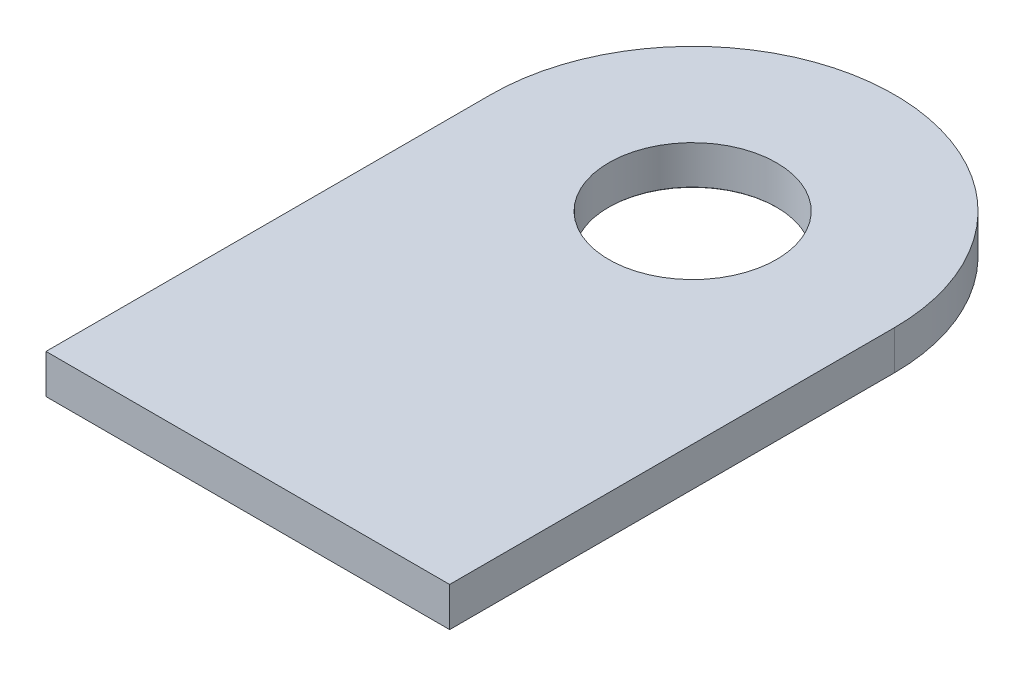
ISO-10303-21;
HEADER;
FILE_DESCRIPTION(('STEP AP214'),'2;1');
FILE_NAME('part.step','',(''),(''),'','','');
FILE_SCHEMA(('AUTOMOTIVE_DESIGN { 1 0 10303 214 1 1 1 1 }'));
ENDSEC;
DATA;
#1=APPLICATION_CONTEXT('core data for automotive mechanical design processes');
#2=APPLICATION_PROTOCOL_DEFINITION('international standard','automotive_design',2000,#1);
#3=PRODUCT_CONTEXT('',#1,'mechanical');
#4=PRODUCT('Part','Part','',(#3));
#5=PRODUCT_RELATED_PRODUCT_CATEGORY('part','',(#4));
#6=PRODUCT_DEFINITION_FORMATION('','',#4);
#7=PRODUCT_DEFINITION_CONTEXT('part definition',#1,'design');
#8=PRODUCT_DEFINITION('design','',#6,#7);
#9=PRODUCT_DEFINITION_SHAPE('','',#8);
#10=(LENGTH_UNIT() NAMED_UNIT(*) SI_UNIT(.MILLI.,.METRE.));
#11=(NAMED_UNIT(*) PLANE_ANGLE_UNIT() SI_UNIT($,.RADIAN.));
#12=(NAMED_UNIT(*) SI_UNIT($,.STERADIAN.) SOLID_ANGLE_UNIT());
#13=UNCERTAINTY_MEASURE_WITH_UNIT(LENGTH_MEASURE(1.E-05),#10,'distance_accuracy_value','');
#14=(GEOMETRIC_REPRESENTATION_CONTEXT(3) GLOBAL_UNCERTAINTY_ASSIGNED_CONTEXT((#13)) GLOBAL_UNIT_ASSIGNED_CONTEXT((#10,
#11,#12)) REPRESENTATION_CONTEXT('',''));
#15=CARTESIAN_POINT('',(0.,0.,0.));
#16=DIRECTION('',(0.,0.,1.));
#17=DIRECTION('',(1.,0.,0.));
#18=AXIS2_PLACEMENT_3D('',#15,#16,#17);
#19=CARTESIAN_POINT('',(0.,1.54,0.));
#20=DIRECTION('',(0.,-1.,0.));
#21=DIRECTION('',(0.,0.,-1.));
#22=AXIS2_PLACEMENT_3D('',#19,#20,#21);
#23=CYLINDRICAL_SURFACE('',#22,7.94);
#24=CARTESIAN_POINT('',(0.,0.,0.));
#25=DIRECTION('',(0.,1.,0.));
#26=DIRECTION('',(0.,0.,1.));
#27=AXIS2_PLACEMENT_3D('',#24,#25,#26);
#28=CIRCLE('',#27,7.94);
#29=CARTESIAN_POINT('',(7.94,0.,0.));
#30=VERTEX_POINT('',#29);
#31=CARTESIAN_POINT('',(-7.94,0.,0.));
#32=VERTEX_POINT('',#31);
#33=EDGE_CURVE('E115',#30,#32,#28,.T.);
#34=ORIENTED_EDGE('',*,*,#33,.T.);
#35=DIRECTION('',(0.,-1.,0.));
#36=VECTOR('',#35,1.);
#37=CARTESIAN_POINT('',(-7.94,1.54,0.));
#38=LINE('',#37,#36);
#39=CARTESIAN_POINT('',(-7.94,1.54,0.));
#40=VERTEX_POINT('',#39);
#41=EDGE_CURVE('E11',#40,#32,#38,.T.);
#42=ORIENTED_EDGE('',*,*,#41,.F.);
#43=CARTESIAN_POINT('',(0.,1.54,0.));
#44=DIRECTION('',(0.,1.,0.));
#45=DIRECTION('',(0.,0.,1.));
#46=AXIS2_PLACEMENT_3D('',#43,#44,#45);
#47=CIRCLE('',#46,7.94);
#48=CARTESIAN_POINT('',(7.94,1.54,0.));
#49=VERTEX_POINT('',#48);
#50=EDGE_CURVE('E99',#49,#40,#47,.T.);
#51=ORIENTED_EDGE('',*,*,#50,.F.);
#52=DIRECTION('',(0.,-1.,0.));
#53=VECTOR('',#52,1.);
#54=CARTESIAN_POINT('',(7.94,1.54,0.));
#55=LINE('',#54,#53);
#56=EDGE_CURVE('E111',#49,#30,#55,.T.);
#57=ORIENTED_EDGE('',*,*,#56,.T.);
#58=EDGE_LOOP('',(#34,#42,#51,#57));
#59=FACE_BOUND('',#58,.T.);
#60=ADVANCED_FACE('F47',(#59),#23,.T.);
#61=CARTESIAN_POINT('',(-7.94,1.54,0.));
#62=DIRECTION('',(1.,0.,0.));
#63=DIRECTION('',(0.,0.,-1.));
#64=AXIS2_PLACEMENT_3D('',#61,#62,#63);
#65=PLANE('',#64);
#66=DIRECTION('',(0.,0.,1.));
#67=VECTOR('',#66,1.);
#68=CARTESIAN_POINT('',(-7.94,0.,0.));
#69=LINE('',#68,#67);
#70=CARTESIAN_POINT('',(-7.94,0.,17.5));
#71=VERTEX_POINT('',#70);
#72=EDGE_CURVE('E104',#32,#71,#69,.T.);
#73=ORIENTED_EDGE('',*,*,#72,.T.);
#74=DIRECTION('',(0.,-1.,0.));
#75=VECTOR('',#74,1.);
#76=CARTESIAN_POINT('',(-7.94,1.54,17.5));
#77=LINE('',#76,#75);
#78=CARTESIAN_POINT('',(-7.94,1.54,17.5));
#79=VERTEX_POINT('',#78);
#80=EDGE_CURVE('E56',#79,#71,#77,.T.);
#81=ORIENTED_EDGE('',*,*,#80,.F.);
#82=DIRECTION('',(0.,0.,1.));
#83=VECTOR('',#82,1.);
#84=CARTESIAN_POINT('',(-7.94,1.54,0.));
#85=LINE('',#84,#83);
#86=EDGE_CURVE('E94',#40,#79,#85,.T.);
#87=ORIENTED_EDGE('',*,*,#86,.F.);
#88=ORIENTED_EDGE('',*,*,#41,.T.);
#89=EDGE_LOOP('',(#73,#81,#87,#88));
#90=FACE_BOUND('',#89,.T.);
#91=ADVANCED_FACE('F103',(#90),#65,.F.);
#92=CARTESIAN_POINT('',(0.,1.54,17.5));
#93=DIRECTION('',(0.,0.,-1.));
#94=DIRECTION('',(-1.,0.,0.));
#95=AXIS2_PLACEMENT_3D('',#92,#93,#94);
#96=PLANE('',#95);
#97=DIRECTION('',(1.,0.,0.));
#98=VECTOR('',#97,1.);
#99=CARTESIAN_POINT('',(0.,0.,17.5));
#100=LINE('',#99,#98);
#101=CARTESIAN_POINT('',(7.94,0.,17.5));
#102=VERTEX_POINT('',#101);
#103=EDGE_CURVE('E81',#71,#102,#100,.T.);
#104=ORIENTED_EDGE('',*,*,#103,.T.);
#105=DIRECTION('',(0.,-1.,0.));
#106=VECTOR('',#105,1.);
#107=CARTESIAN_POINT('',(7.94,1.54,17.5));
#108=LINE('',#107,#106);
#109=CARTESIAN_POINT('',(7.94,1.54,17.5));
#110=VERTEX_POINT('',#109);
#111=EDGE_CURVE('E106',#110,#102,#108,.T.);
#112=ORIENTED_EDGE('',*,*,#111,.F.);
#113=DIRECTION('',(1.,0.,0.));
#114=VECTOR('',#113,1.);
#115=CARTESIAN_POINT('',(0.,1.54,17.5));
#116=LINE('',#115,#114);
#117=EDGE_CURVE('E97',#79,#110,#116,.T.);
#118=ORIENTED_EDGE('',*,*,#117,.F.);
#119=ORIENTED_EDGE('',*,*,#80,.T.);
#120=EDGE_LOOP('',(#104,#112,#118,#119));
#121=FACE_BOUND('',#120,.T.);
#122=ADVANCED_FACE('F107',(#121),#96,.F.);
#123=CARTESIAN_POINT('',(7.94,1.54,0.));
#124=DIRECTION('',(-1.,0.,0.));
#125=DIRECTION('',(0.,0.,1.));
#126=AXIS2_PLACEMENT_3D('',#123,#124,#125);
#127=PLANE('',#126);
#128=DIRECTION('',(0.,0.,-1.));
#129=VECTOR('',#128,1.);
#130=CARTESIAN_POINT('',(7.94,0.,0.));
#131=LINE('',#130,#129);
#132=EDGE_CURVE('E87',#102,#30,#131,.T.);
#133=ORIENTED_EDGE('',*,*,#132,.T.);
#134=ORIENTED_EDGE('',*,*,#56,.F.);
#135=DIRECTION('',(0.,0.,-1.));
#136=VECTOR('',#135,1.);
#137=CARTESIAN_POINT('',(7.94,1.54,0.));
#138=LINE('',#137,#136);
#139=EDGE_CURVE('E64',#110,#49,#138,.T.);
#140=ORIENTED_EDGE('',*,*,#139,.F.);
#141=ORIENTED_EDGE('',*,*,#111,.T.);
#142=EDGE_LOOP('',(#133,#134,#140,#141));
#143=FACE_BOUND('',#142,.T.);
#144=ADVANCED_FACE('F129',(#143),#127,.F.);
#145=CARTESIAN_POINT('',(0.,1.54,0.));
#146=DIRECTION('',(0.,1.,0.));
#147=DIRECTION('',(0.,0.,1.));
#148=AXIS2_PLACEMENT_3D('',#145,#146,#147);
#149=PLANE('',#148);
#150=CARTESIAN_POINT('',(0.,1.54,0.));
#151=DIRECTION('',(0.,-1.,0.));
#152=DIRECTION('',(0.,0.,-1.));
#153=AXIS2_PLACEMENT_3D('',#150,#151,#152);
#154=CIRCLE('',#153,3.3);
#155=CARTESIAN_POINT('',(0.,1.54,-3.3));
#156=VERTEX_POINT('',#155);
#157=EDGE_CURVE('E119',#156,#156,#154,.T.);
#158=ORIENTED_EDGE('',*,*,#157,.T.);
#159=EDGE_LOOP('',(#158));
#160=FACE_BOUND('',#159,.T.);
#161=ORIENTED_EDGE('',*,*,#50,.T.);
#162=ORIENTED_EDGE('',*,*,#86,.T.);
#163=ORIENTED_EDGE('',*,*,#117,.T.);
#164=ORIENTED_EDGE('',*,*,#139,.T.);
#165=EDGE_LOOP('',(#161,#162,#163,#164));
#166=FACE_BOUND('',#165,.T.);
#167=ADVANCED_FACE('F95',(#160,#166),#149,.T.);
#168=CARTESIAN_POINT('',(0.,0.,0.));
#169=DIRECTION('',(0.,1.,0.));
#170=DIRECTION('',(0.,0.,1.));
#171=AXIS2_PLACEMENT_3D('',#168,#169,#170);
#172=PLANE('',#171);
#173=CARTESIAN_POINT('',(0.,0.,0.));
#174=DIRECTION('',(0.,-1.,0.));
#175=DIRECTION('',(0.,0.,-1.));
#176=AXIS2_PLACEMENT_3D('',#173,#174,#175);
#177=CIRCLE('',#176,3.325);
#178=CARTESIAN_POINT('',(0.,0.,-3.325));
#179=VERTEX_POINT('',#178);
#180=EDGE_CURVE('E143',#179,#179,#177,.T.);
#181=ORIENTED_EDGE('',*,*,#180,.F.);
#182=EDGE_LOOP('',(#181));
#183=FACE_BOUND('',#182,.T.);
#184=ORIENTED_EDGE('',*,*,#33,.F.);
#185=ORIENTED_EDGE('',*,*,#132,.F.);
#186=ORIENTED_EDGE('',*,*,#103,.F.);
#187=ORIENTED_EDGE('',*,*,#72,.F.);
#188=EDGE_LOOP('',(#184,#185,#186,#187));
#189=FACE_BOUND('',#188,.T.);
#190=ADVANCED_FACE('F132',(#183,#189),#172,.F.);
#191=CARTESIAN_POINT('',(0.,0.,0.));
#192=DIRECTION('',(0.,-1.,0.));
#193=DIRECTION('',(0.,0.,-1.));
#194=AXIS2_PLACEMENT_3D('',#191,#192,#193);
#195=CYLINDRICAL_SURFACE('',#194,3.3);
#196=ORIENTED_EDGE('',*,*,#157,.F.);
#197=EDGE_LOOP('',(#196));
#198=FACE_BOUND('',#197,.T.);
#199=CARTESIAN_POINT('',(0.,0.0249999999999998,0.));
#200=DIRECTION('',(0.,-1.,0.));
#201=DIRECTION('',(0.,0.,-1.));
#202=AXIS2_PLACEMENT_3D('',#199,#200,#201);
#203=CIRCLE('',#202,3.3);
#204=CARTESIAN_POINT('',(0.,0.0249999999999998,-3.3));
#205=VERTEX_POINT('',#204);
#206=EDGE_CURVE('E139',#205,#205,#203,.T.);
#207=ORIENTED_EDGE('',*,*,#206,.T.);
#208=EDGE_LOOP('',(#207));
#209=FACE_BOUND('',#208,.T.);
#210=ADVANCED_FACE('F151',(#198,#209),#195,.F.);
#211=CARTESIAN_POINT('',(0.,0.,0.));
#212=DIRECTION('',(0.,-1.,0.));
#213=DIRECTION('',(0.,0.,-1.));
#214=AXIS2_PLACEMENT_3D('',#211,#212,#213);
#215=CONICAL_SURFACE('',#214,3.325,0.785398163397414);
#216=ORIENTED_EDGE('',*,*,#206,.F.);
#217=EDGE_LOOP('',(#216));
#218=FACE_BOUND('',#217,.T.);
#219=ORIENTED_EDGE('',*,*,#180,.T.);
#220=EDGE_LOOP('',(#219));
#221=FACE_BOUND('',#220,.T.);
#222=ADVANCED_FACE('F148',(#218,#221),#215,.F.);
#223=CLOSED_SHELL('',(#60,#91,#122,#144,#167,#190,#210,#222));
#224=MANIFOLD_SOLID_BREP('B2',#223);
#225=ADVANCED_BREP_SHAPE_REPRESENTATION('',(#18,#224),#14);
#226=SHAPE_DEFINITION_REPRESENTATION(#9,#225);
ENDSEC;
END-ISO-10303-21;
